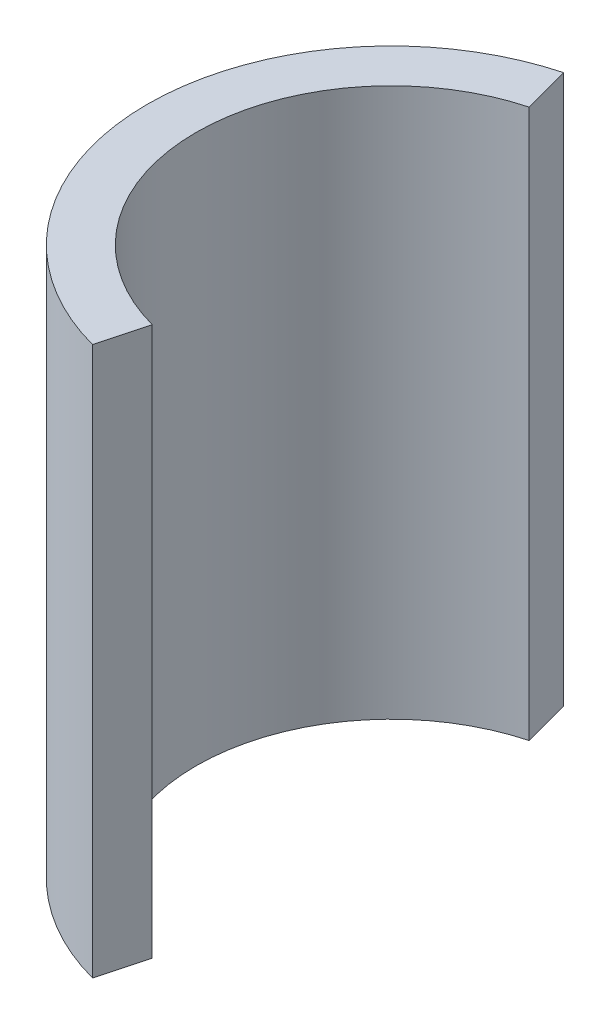
ISO-10303-21;
HEADER;
FILE_DESCRIPTION(('STEP AP214'),'2;1');
FILE_NAME('part.step','',(''),(''),'','','');
FILE_SCHEMA(('AUTOMOTIVE_DESIGN { 1 0 10303 214 1 1 1 1 }'));
ENDSEC;
DATA;
#1=APPLICATION_CONTEXT('core data for automotive mechanical design processes');
#2=APPLICATION_PROTOCOL_DEFINITION('international standard','automotive_design',2000,#1);
#3=PRODUCT_CONTEXT('',#1,'mechanical');
#4=PRODUCT('Part','Part','',(#3));
#5=PRODUCT_RELATED_PRODUCT_CATEGORY('part','',(#4));
#6=PRODUCT_DEFINITION_FORMATION('','',#4);
#7=PRODUCT_DEFINITION_CONTEXT('part definition',#1,'design');
#8=PRODUCT_DEFINITION('design','',#6,#7);
#9=PRODUCT_DEFINITION_SHAPE('','',#8);
#10=(LENGTH_UNIT() NAMED_UNIT(*) SI_UNIT(.MILLI.,.METRE.));
#11=(NAMED_UNIT(*) PLANE_ANGLE_UNIT() SI_UNIT($,.RADIAN.));
#12=(NAMED_UNIT(*) SI_UNIT($,.STERADIAN.) SOLID_ANGLE_UNIT());
#13=UNCERTAINTY_MEASURE_WITH_UNIT(LENGTH_MEASURE(1.E-05),#10,'distance_accuracy_value','');
#14=(GEOMETRIC_REPRESENTATION_CONTEXT(3) GLOBAL_UNCERTAINTY_ASSIGNED_CONTEXT((#13)) GLOBAL_UNIT_ASSIGNED_CONTEXT((#10,
#11,#12)) REPRESENTATION_CONTEXT('',''));
#15=CARTESIAN_POINT('',(0.,0.,0.));
#16=DIRECTION('',(0.,0.,1.));
#17=DIRECTION('',(1.,0.,0.));
#18=AXIS2_PLACEMENT_3D('',#15,#16,#17);
#19=CARTESIAN_POINT('',(0.,22.5,0.));
#20=DIRECTION('',(0.,-1.,0.));
#21=DIRECTION('',(0.,0.,-1.));
#22=AXIS2_PLACEMENT_3D('',#19,#20,#21);
#23=CYLINDRICAL_SURFACE('',#22,20.);
#24=CARTESIAN_POINT('',(0.,-22.5,0.));
#25=DIRECTION('',(0.,1.,0.));
#26=DIRECTION('',(0.,0.,1.));
#27=AXIS2_PLACEMENT_3D('',#24,#25,#26);
#28=CIRCLE('',#27,20.);
#29=CARTESIAN_POINT('',(-5.17638090205029,-22.5,-19.3185165257814));
#30=VERTEX_POINT('',#29);
#31=CARTESIAN_POINT('',(-5.17638090205029,-22.5,19.3185165257814));
#32=VERTEX_POINT('',#31);
#33=EDGE_CURVE('E96',#30,#32,#28,.T.);
#34=ORIENTED_EDGE('',*,*,#33,.T.);
#35=DIRECTION('',(0.,-1.,0.));
#36=VECTOR('',#35,1.);
#37=CARTESIAN_POINT('',(-5.17638090205029,22.5,19.3185165257814));
#38=LINE('',#37,#36);
#39=CARTESIAN_POINT('',(-5.17638090205029,22.5,19.3185165257814));
#40=VERTEX_POINT('',#39);
#41=EDGE_CURVE('E11',#40,#32,#38,.T.);
#42=ORIENTED_EDGE('',*,*,#41,.F.);
#43=CARTESIAN_POINT('',(0.,22.5,0.));
#44=DIRECTION('',(0.,1.,0.));
#45=DIRECTION('',(0.,0.,1.));
#46=AXIS2_PLACEMENT_3D('',#43,#44,#45);
#47=CIRCLE('',#46,20.);
#48=CARTESIAN_POINT('',(-5.17638090205029,22.5,-19.3185165257814));
#49=VERTEX_POINT('',#48);
#50=EDGE_CURVE('E84',#49,#40,#47,.T.);
#51=ORIENTED_EDGE('',*,*,#50,.F.);
#52=DIRECTION('',(0.,-1.,0.));
#53=VECTOR('',#52,1.);
#54=CARTESIAN_POINT('',(-5.17638090205029,22.5,-19.3185165257814));
#55=LINE('',#54,#53);
#56=EDGE_CURVE('E92',#49,#30,#55,.T.);
#57=ORIENTED_EDGE('',*,*,#56,.T.);
#58=EDGE_LOOP('',(#34,#42,#51,#57));
#59=FACE_BOUND('',#58,.T.);
#60=ADVANCED_FACE('F33',(#59),#23,.T.);
#61=CARTESIAN_POINT('',(-4.14110472164023,22.5,15.4548132206251));
#62=DIRECTION('',(-0.96592582628907,0.,-0.258819045102514));
#63=DIRECTION('',(-0.258819045102515,0.,0.96592582628907));
#64=AXIS2_PLACEMENT_3D('',#61,#62,#63);
#65=PLANE('',#64);
#66=DIRECTION('',(0.258819045102514,0.,-0.96592582628907));
#67=VECTOR('',#66,1.);
#68=CARTESIAN_POINT('',(-4.14110472164023,-22.5,15.4548132206251));
#69=LINE('',#68,#67);
#70=CARTESIAN_POINT('',(-4.14110472164024,-22.5,15.4548132206251));
#71=VERTEX_POINT('',#70);
#72=EDGE_CURVE('E88',#32,#71,#69,.T.);
#73=ORIENTED_EDGE('',*,*,#72,.T.);
#74=DIRECTION('',(0.,-1.,0.));
#75=VECTOR('',#74,1.);
#76=CARTESIAN_POINT('',(-4.14110472164024,22.5,15.4548132206251));
#77=LINE('',#76,#75);
#78=CARTESIAN_POINT('',(-4.14110472164024,22.5,15.4548132206251));
#79=VERTEX_POINT('',#78);
#80=EDGE_CURVE('E41',#79,#71,#77,.T.);
#81=ORIENTED_EDGE('',*,*,#80,.F.);
#82=DIRECTION('',(0.258819045102514,0.,-0.96592582628907));
#83=VECTOR('',#82,1.);
#84=CARTESIAN_POINT('',(-4.14110472164023,22.5,15.4548132206251));
#85=LINE('',#84,#83);
#86=EDGE_CURVE('E79',#40,#79,#85,.T.);
#87=ORIENTED_EDGE('',*,*,#86,.F.);
#88=ORIENTED_EDGE('',*,*,#41,.T.);
#89=EDGE_LOOP('',(#73,#81,#87,#88));
#90=FACE_BOUND('',#89,.T.);
#91=ADVANCED_FACE('F87',(#90),#65,.F.);
#92=CARTESIAN_POINT('',(0.,22.5,0.));
#93=DIRECTION('',(0.,-1.,0.));
#94=DIRECTION('',(0.,0.,-1.));
#95=AXIS2_PLACEMENT_3D('',#92,#93,#94);
#96=CYLINDRICAL_SURFACE('',#95,16.);
#97=CARTESIAN_POINT('',(0.,-22.5,0.));
#98=DIRECTION('',(0.,-1.,0.));
#99=DIRECTION('',(0.,0.,1.));
#100=AXIS2_PLACEMENT_3D('',#97,#98,#99);
#101=CIRCLE('',#100,16.);
#102=CARTESIAN_POINT('',(-4.14110472164023,-22.5,-15.4548132206251));
#103=VERTEX_POINT('',#102);
#104=EDGE_CURVE('E66',#71,#103,#101,.T.);
#105=ORIENTED_EDGE('',*,*,#104,.T.);
#106=DIRECTION('',(0.,-1.,0.));
#107=VECTOR('',#106,1.);
#108=CARTESIAN_POINT('',(-4.14110472164023,22.5,-15.4548132206251));
#109=LINE('',#108,#107);
#110=CARTESIAN_POINT('',(-4.14110472164023,22.5,-15.4548132206251));
#111=VERTEX_POINT('',#110);
#112=EDGE_CURVE('E89',#111,#103,#109,.T.);
#113=ORIENTED_EDGE('',*,*,#112,.F.);
#114=CARTESIAN_POINT('',(0.,22.5,0.));
#115=DIRECTION('',(0.,-1.,0.));
#116=DIRECTION('',(0.,0.,1.));
#117=AXIS2_PLACEMENT_3D('',#114,#115,#116);
#118=CIRCLE('',#117,16.);
#119=EDGE_CURVE('E82',#79,#111,#118,.T.);
#120=ORIENTED_EDGE('',*,*,#119,.F.);
#121=ORIENTED_EDGE('',*,*,#80,.T.);
#122=EDGE_LOOP('',(#105,#113,#120,#121));
#123=FACE_BOUND('',#122,.T.);
#124=ADVANCED_FACE('F90',(#123),#96,.F.);
#125=CARTESIAN_POINT('',(-5.17638090205029,22.5,-19.3185165257814));
#126=DIRECTION('',(-0.96592582628907,0.,0.258819045102514));
#127=DIRECTION('',(0.258819045102515,0.,0.96592582628907));
#128=AXIS2_PLACEMENT_3D('',#125,#126,#127);
#129=PLANE('',#128);
#130=DIRECTION('',(-0.258819045102514,0.,-0.96592582628907));
#131=VECTOR('',#130,1.);
#132=CARTESIAN_POINT('',(-5.17638090205029,-22.5,-19.3185165257814));
#133=LINE('',#132,#131);
#134=EDGE_CURVE('E72',#103,#30,#133,.T.);
#135=ORIENTED_EDGE('',*,*,#134,.T.);
#136=ORIENTED_EDGE('',*,*,#56,.F.);
#137=DIRECTION('',(-0.258819045102514,0.,-0.96592582628907));
#138=VECTOR('',#137,1.);
#139=CARTESIAN_POINT('',(-5.17638090205029,22.5,-19.3185165257814));
#140=LINE('',#139,#138);
#141=EDGE_CURVE('E49',#111,#49,#140,.T.);
#142=ORIENTED_EDGE('',*,*,#141,.F.);
#143=ORIENTED_EDGE('',*,*,#112,.T.);
#144=EDGE_LOOP('',(#135,#136,#142,#143));
#145=FACE_BOUND('',#144,.T.);
#146=ADVANCED_FACE('F103',(#145),#129,.F.);
#147=CARTESIAN_POINT('',(0.,22.5,0.));
#148=DIRECTION('',(0.,1.,0.));
#149=DIRECTION('',(0.,0.,1.));
#150=AXIS2_PLACEMENT_3D('',#147,#148,#149);
#151=PLANE('',#150);
#152=ORIENTED_EDGE('',*,*,#50,.T.);
#153=ORIENTED_EDGE('',*,*,#86,.T.);
#154=ORIENTED_EDGE('',*,*,#119,.T.);
#155=ORIENTED_EDGE('',*,*,#141,.T.);
#156=EDGE_LOOP('',(#152,#153,#154,#155));
#157=FACE_BOUND('',#156,.T.);
#158=ADVANCED_FACE('F80',(#157),#151,.T.);
#159=CARTESIAN_POINT('',(0.,-22.5,0.));
#160=DIRECTION('',(0.,1.,0.));
#161=DIRECTION('',(0.,0.,1.));
#162=AXIS2_PLACEMENT_3D('',#159,#160,#161);
#163=PLANE('',#162);
#164=ORIENTED_EDGE('',*,*,#33,.F.);
#165=ORIENTED_EDGE('',*,*,#134,.F.);
#166=ORIENTED_EDGE('',*,*,#104,.F.);
#167=ORIENTED_EDGE('',*,*,#72,.F.);
#168=EDGE_LOOP('',(#164,#165,#166,#167));
#169=FACE_BOUND('',#168,.T.);
#170=ADVANCED_FACE('F106',(#169),#163,.F.);
#171=CLOSED_SHELL('',(#60,#91,#124,#146,#158,#170));
#172=MANIFOLD_SOLID_BREP('B2',#171);
#173=ADVANCED_BREP_SHAPE_REPRESENTATION('',(#18,#172),#14);
#174=SHAPE_DEFINITION_REPRESENTATION(#9,#173);
ENDSEC;
END-ISO-10303-21;
